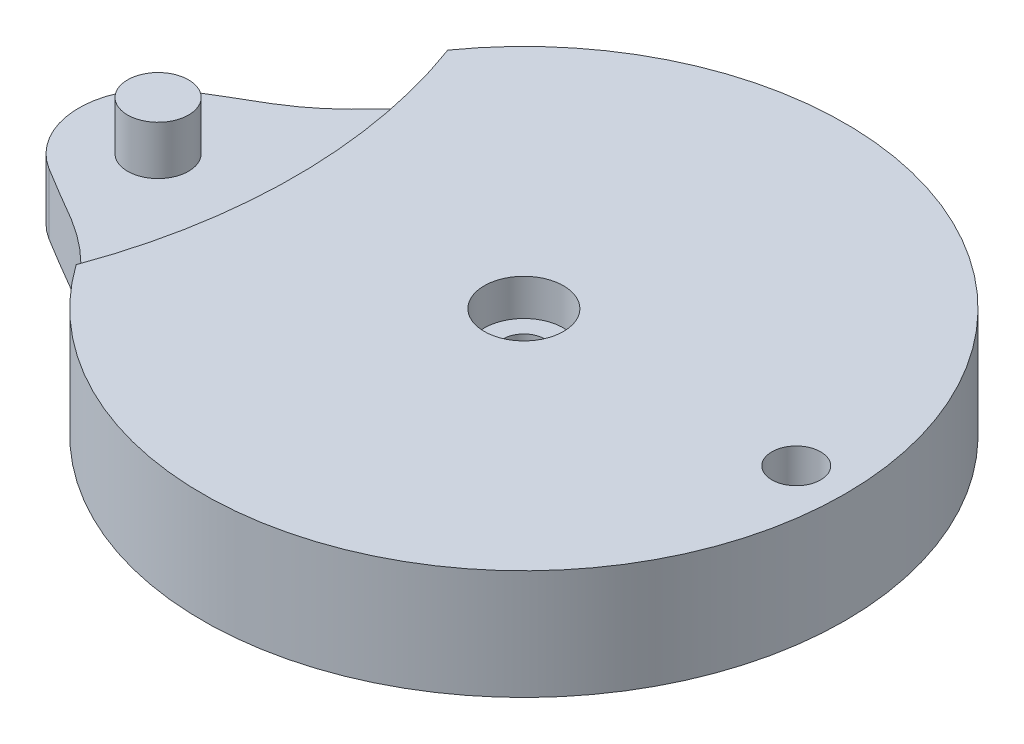
ISO-10303-21;
HEADER;
FILE_DESCRIPTION(('STEP AP214'),'2;1');
FILE_NAME('part.step','',(''),(''),'','','');
FILE_SCHEMA(('AUTOMOTIVE_DESIGN { 1 0 10303 214 1 1 1 1 }'));
ENDSEC;
DATA;
#1=APPLICATION_CONTEXT('core data for automotive mechanical design processes');
#2=APPLICATION_PROTOCOL_DEFINITION('international standard','automotive_design',2000,#1);
#3=PRODUCT_CONTEXT('',#1,'mechanical');
#4=PRODUCT('Part','Part','',(#3));
#5=PRODUCT_RELATED_PRODUCT_CATEGORY('part','',(#4));
#6=PRODUCT_DEFINITION_FORMATION('','',#4);
#7=PRODUCT_DEFINITION_CONTEXT('part definition',#1,'design');
#8=PRODUCT_DEFINITION('design','',#6,#7);
#9=PRODUCT_DEFINITION_SHAPE('','',#8);
#10=(LENGTH_UNIT() NAMED_UNIT(*) SI_UNIT(.MILLI.,.METRE.));
#11=(NAMED_UNIT(*) PLANE_ANGLE_UNIT() SI_UNIT($,.RADIAN.));
#12=(NAMED_UNIT(*) SI_UNIT($,.STERADIAN.) SOLID_ANGLE_UNIT());
#13=UNCERTAINTY_MEASURE_WITH_UNIT(LENGTH_MEASURE(1.E-05),#10,'distance_accuracy_value','');
#14=(GEOMETRIC_REPRESENTATION_CONTEXT(3) GLOBAL_UNCERTAINTY_ASSIGNED_CONTEXT((#13)) GLOBAL_UNIT_ASSIGNED_CONTEXT((#10,
#11,#12)) REPRESENTATION_CONTEXT('',''));
#15=CARTESIAN_POINT('',(0.,0.,0.));
#16=DIRECTION('',(0.,0.,1.));
#17=DIRECTION('',(1.,0.,0.));
#18=AXIS2_PLACEMENT_3D('',#15,#16,#17);
#19=CARTESIAN_POINT('',(0.,5.,0.));
#20=DIRECTION('',(0.,1.,0.));
#21=DIRECTION('',(0.,0.,1.));
#22=AXIS2_PLACEMENT_3D('',#19,#20,#21);
#23=PLANE('',#22);
#24=CARTESIAN_POINT('',(32.7560616139069,5.,0.));
#25=DIRECTION('',(0.,1.,0.));
#26=DIRECTION('',(0.,0.,1.));
#27=AXIS2_PLACEMENT_3D('',#24,#25,#26);
#28=CIRCLE('',#27,2.5);
#29=CARTESIAN_POINT('',(32.7560616139069,5.,2.5));
#30=VERTEX_POINT('',#29);
#31=EDGE_CURVE('E208',#30,#30,#28,.T.);
#32=ORIENTED_EDGE('',*,*,#31,.F.);
#33=EDGE_LOOP('',(#32));
#34=FACE_BOUND('',#33,.T.);
#35=CARTESIAN_POINT('',(29.2912891067249,5.,5.49957739044341));
#36=CARTESIAN_POINT('',(34.6216413062491,5.,8.85773683494919));
#37=CARTESIAN_POINT('',(35.589011304671,5.,8.41636074992716));
#38=CARTESIAN_POINT('',(41.2767844398048,5.,15.2389982055871));
#39=B_SPLINE_CURVE_WITH_KNOTS('',3,(#35,#36,#37,#38),.UNSPECIFIED.,.F.,.F.,(4,4),(0.,1.),.UNSPECIFIED.);
#40=CARTESIAN_POINT('',(29.2912891067249,5.,5.49957739044341));
#41=VERTEX_POINT('',#40);
#42=CARTESIAN_POINT('',(41.2767844398048,5.,15.2389982055871));
#43=VERTEX_POINT('',#42);
#44=EDGE_CURVE('E205',#41,#43,#39,.T.);
#45=ORIENTED_EDGE('',*,*,#44,.T.);
#46=CARTESIAN_POINT('',(0.,5.,0.));
#47=DIRECTION('',(0.,1.,0.));
#48=DIRECTION('',(0.,0.,1.));
#49=AXIS2_PLACEMENT_3D('',#46,#47,#48);
#50=CIRCLE('',#49,44.);
#51=CARTESIAN_POINT('',(41.2767844398048,5.,-15.2389982055871));
#52=VERTEX_POINT('',#51);
#53=EDGE_CURVE('E181',#43,#52,#50,.T.);
#54=ORIENTED_EDGE('',*,*,#53,.T.);
#55=CARTESIAN_POINT('',(29.2912891067249,5.,-5.49957739044341));
#56=CARTESIAN_POINT('',(34.6216413062491,5.,-8.85773683494919));
#57=CARTESIAN_POINT('',(35.589011304671,5.,-8.41636074992716));
#58=CARTESIAN_POINT('',(41.2767844398048,5.,-15.2389982055871));
#59=B_SPLINE_CURVE_WITH_KNOTS('',3,(#55,#56,#57,#58),.UNSPECIFIED.,.F.,.F.,(4,4),(0.,1.),.UNSPECIFIED.);
#60=CARTESIAN_POINT('',(29.2912891067249,5.,-5.49957739044341));
#61=VERTEX_POINT('',#60);
#62=EDGE_CURVE('E199',#61,#52,#59,.T.);
#63=ORIENTED_EDGE('',*,*,#62,.F.);
#64=CARTESIAN_POINT('',(32.7560616139069,5.,0.));
#65=DIRECTION('',(0.,1.,0.));
#66=DIRECTION('',(0.,0.,1.));
#67=AXIS2_PLACEMENT_3D('',#64,#65,#66);
#68=CIRCLE('',#67,6.5);
#69=EDGE_CURVE('E192',#61,#41,#68,.T.);
#70=ORIENTED_EDGE('',*,*,#69,.T.);
#71=EDGE_LOOP('',(#45,#54,#63,#70));
#72=FACE_BOUND('',#71,.T.);
#73=ADVANCED_FACE('F43',(#34,#72),#23,.T.);
#74=DIRECTION('',(0.,-1.,0.));
#75=VECTOR('',#74,1.);
#76=SURFACE_OF_LINEAR_EXTRUSION('',#59,#75);
#77=CARTESIAN_POINT('',(29.2912891067249,0.,-5.49957739044341));
#78=CARTESIAN_POINT('',(34.6216413062491,0.,-8.85773683494919));
#79=CARTESIAN_POINT('',(35.589011304671,0.,-8.41636074992716));
#80=CARTESIAN_POINT('',(41.2767844398048,0.,-15.2389982055871));
#81=B_SPLINE_CURVE_WITH_KNOTS('',3,(#77,#78,#79,#80),.UNSPECIFIED.,.F.,.F.,(4,4),(0.,1.),.UNSPECIFIED.);
#82=CARTESIAN_POINT('',(29.2912891067249,0.,-5.49957739044341));
#83=VERTEX_POINT('',#82);
#84=CARTESIAN_POINT('',(41.2767844398048,0.,-15.2389982055871));
#85=VERTEX_POINT('',#84);
#86=EDGE_CURVE('E187',#83,#85,#81,.T.);
#87=ORIENTED_EDGE('',*,*,#86,.F.);
#88=DIRECTION('',(0.,-1.,0.));
#89=VECTOR('',#88,1.);
#90=CARTESIAN_POINT('',(29.2912891067249,5.,-5.49957739044341));
#91=LINE('',#90,#89);
#92=EDGE_CURVE('E11',#61,#83,#91,.T.);
#93=ORIENTED_EDGE('',*,*,#92,.F.);
#94=ORIENTED_EDGE('',*,*,#62,.T.);
#95=DIRECTION('',(0.,-1.,0.));
#96=VECTOR('',#95,1.);
#97=CARTESIAN_POINT('',(41.2767844398048,5.,-15.2389982055871));
#98=LINE('',#97,#96);
#99=EDGE_CURVE('E91',#52,#85,#98,.T.);
#100=ORIENTED_EDGE('',*,*,#99,.T.);
#101=EDGE_LOOP('',(#87,#93,#94,#100));
#102=FACE_BOUND('',#101,.T.);
#103=ADVANCED_FACE('F45',(#102),#76,.T.);
#104=CARTESIAN_POINT('',(32.7560616139069,5.,0.));
#105=DIRECTION('',(0.,-1.,0.));
#106=DIRECTION('',(0.,0.,-1.));
#107=AXIS2_PLACEMENT_3D('',#104,#105,#106);
#108=CYLINDRICAL_SURFACE('',#107,6.5);
#109=CARTESIAN_POINT('',(32.7560616139069,0.,0.));
#110=DIRECTION('',(0.,1.,0.));
#111=DIRECTION('',(0.,0.,1.));
#112=AXIS2_PLACEMENT_3D('',#109,#110,#111);
#113=CIRCLE('',#112,6.5);
#114=CARTESIAN_POINT('',(29.2912891067249,0.,5.49957739044341));
#115=VERTEX_POINT('',#114);
#116=EDGE_CURVE('E262',#83,#115,#113,.T.);
#117=ORIENTED_EDGE('',*,*,#116,.T.);
#118=DIRECTION('',(0.,-1.,0.));
#119=VECTOR('',#118,1.);
#120=CARTESIAN_POINT('',(29.2912891067249,5.,5.49957739044341));
#121=LINE('',#120,#119);
#122=EDGE_CURVE('E53',#41,#115,#121,.T.);
#123=ORIENTED_EDGE('',*,*,#122,.F.);
#124=ORIENTED_EDGE('',*,*,#69,.F.);
#125=ORIENTED_EDGE('',*,*,#92,.T.);
#126=EDGE_LOOP('',(#117,#123,#124,#125));
#127=FACE_BOUND('',#126,.T.);
#128=ADVANCED_FACE('F224',(#127),#108,.T.);
#129=DIRECTION('',(0.,-1.,0.));
#130=VECTOR('',#129,1.);
#131=SURFACE_OF_LINEAR_EXTRUSION('',#39,#130);
#132=CARTESIAN_POINT('',(29.2912891067249,0.,5.49957739044341));
#133=CARTESIAN_POINT('',(34.6216413062491,0.,8.85773683494919));
#134=CARTESIAN_POINT('',(35.589011304671,0.,8.41636074992716));
#135=CARTESIAN_POINT('',(41.2767844398048,0.,15.2389982055871));
#136=B_SPLINE_CURVE_WITH_KNOTS('',3,(#132,#133,#134,#135),.UNSPECIFIED.,.F.,.F.,(4,4),(0.,1.),.UNSPECIFIED.);
#137=CARTESIAN_POINT('',(41.2767844398048,0.,15.2389982055871));
#138=VERTEX_POINT('',#137);
#139=EDGE_CURVE('E260',#115,#138,#136,.T.);
#140=ORIENTED_EDGE('',*,*,#139,.T.);
#141=DIRECTION('',(0.,-1.,0.));
#142=VECTOR('',#141,1.);
#143=CARTESIAN_POINT('',(41.2767844398048,5.,15.2389982055871));
#144=LINE('',#143,#142);
#145=EDGE_CURVE('E209',#43,#138,#144,.T.);
#146=ORIENTED_EDGE('',*,*,#145,.F.);
#147=ORIENTED_EDGE('',*,*,#44,.F.);
#148=ORIENTED_EDGE('',*,*,#122,.T.);
#149=EDGE_LOOP('',(#140,#146,#147,#148));
#150=FACE_BOUND('',#149,.T.);
#151=ADVANCED_FACE('F220',(#150),#131,.F.);
#152=CARTESIAN_POINT('',(62.7560616139069,5.,0.));
#153=DIRECTION('',(0.,-1.,0.));
#154=DIRECTION('',(0.,0.,-1.));
#155=AXIS2_PLACEMENT_3D('',#152,#153,#154);
#156=CYLINDRICAL_SURFACE('',#155,26.3360288242511);
#157=CARTESIAN_POINT('',(62.7560616139069,0.,0.));
#158=DIRECTION('',(0.,1.,0.));
#159=DIRECTION('',(0.,0.,1.));
#160=AXIS2_PLACEMENT_3D('',#157,#158,#159);
#161=CIRCLE('',#160,26.3360288242511);
#162=EDGE_CURVE('E202',#85,#138,#161,.F.);
#163=ORIENTED_EDGE('',*,*,#162,.F.);
#164=ORIENTED_EDGE('',*,*,#99,.F.);
#165=DIRECTION('',(0.,-1.,0.));
#166=VECTOR('',#165,1.);
#167=CARTESIAN_POINT('',(41.2767844398048,9.,-15.2389982055871));
#168=LINE('',#167,#166);
#169=CARTESIAN_POINT('',(41.2767844398048,9.,-15.2389982055871));
#170=VERTEX_POINT('',#169);
#171=EDGE_CURVE('E70',#170,#52,#168,.T.);
#172=ORIENTED_EDGE('',*,*,#171,.F.);
#173=CARTESIAN_POINT('',(62.7560616139069,9.,0.));
#174=DIRECTION('',(0.,-1.,0.));
#175=DIRECTION('',(0.,0.,-1.));
#176=AXIS2_PLACEMENT_3D('',#173,#174,#175);
#177=CIRCLE('',#176,26.3360288242511);
#178=CARTESIAN_POINT('',(41.2767844398048,9.,15.2389982055871));
#179=VERTEX_POINT('',#178);
#180=EDGE_CURVE('E179',#170,#179,#177,.T.);
#181=ORIENTED_EDGE('',*,*,#180,.T.);
#182=DIRECTION('',(0.,-1.,0.));
#183=VECTOR('',#182,1.);
#184=CARTESIAN_POINT('',(41.2767844398048,9.,15.2389982055871));
#185=LINE('',#184,#183);
#186=EDGE_CURVE('E174',#179,#43,#185,.T.);
#187=ORIENTED_EDGE('',*,*,#186,.T.);
#188=ORIENTED_EDGE('',*,*,#145,.T.);
#189=EDGE_LOOP('',(#163,#164,#172,#181,#187,#188));
#190=FACE_BOUND('',#189,.T.);
#191=ADVANCED_FACE('F223',(#190),#156,.T.);
#192=CARTESIAN_POINT('',(0.,0.,0.));
#193=DIRECTION('',(0.,1.,0.));
#194=DIRECTION('',(0.,0.,1.));
#195=AXIS2_PLACEMENT_3D('',#192,#193,#194);
#196=PLANE('',#195);
#197=DIRECTION('',(1.,0.,0.));
#198=VECTOR('',#197,1.);
#199=CARTESIAN_POINT('',(0.,0.,-1.));
#200=LINE('',#199,#198);
#201=CARTESIAN_POINT('',(67.3996055191585,0.,-1.));
#202=VERTEX_POINT('',#201);
#203=CARTESIAN_POINT('',(70.5060616139069,0.,-1.));
#204=VERTEX_POINT('',#203);
#205=EDGE_CURVE('E154',#202,#204,#200,.T.);
#206=ORIENTED_EDGE('',*,*,#205,.F.);
#207=CARTESIAN_POINT('',(62.7560616139069,0.,0.));
#208=DIRECTION('',(0.,-1.,0.));
#209=DIRECTION('',(0.,0.,-1.));
#210=AXIS2_PLACEMENT_3D('',#207,#208,#209);
#211=CIRCLE('',#210,4.75);
#212=CARTESIAN_POINT('',(67.3996055191585,0.,1.));
#213=VERTEX_POINT('',#212);
#214=EDGE_CURVE('E61',#213,#202,#211,.T.);
#215=ORIENTED_EDGE('',*,*,#214,.F.);
#216=DIRECTION('',(1.,0.,0.));
#217=VECTOR('',#216,1.);
#218=CARTESIAN_POINT('',(0.,0.,1.));
#219=LINE('',#218,#217);
#220=CARTESIAN_POINT('',(70.5060616139069,0.,1.));
#221=VERTEX_POINT('',#220);
#222=EDGE_CURVE('E142',#213,#221,#219,.T.);
#223=ORIENTED_EDGE('',*,*,#222,.T.);
#224=DIRECTION('',(0.,0.,-1.));
#225=VECTOR('',#224,1.);
#226=CARTESIAN_POINT('',(70.5060616139069,0.,0.));
#227=LINE('',#226,#225);
#228=EDGE_CURVE('E145',#221,#204,#227,.T.);
#229=ORIENTED_EDGE('',*,*,#228,.T.);
#230=EDGE_LOOP('',(#206,#215,#223,#229));
#231=FACE_BOUND('',#230,.T.);
#232=CARTESIAN_POINT('',(85.092090438158,0.,0.));
#233=DIRECTION('',(0.,1.,0.));
#234=DIRECTION('',(0.,0.,1.));
#235=AXIS2_PLACEMENT_3D('',#232,#233,#234);
#236=CIRCLE('',#235,2.);
#237=CARTESIAN_POINT('',(85.092090438158,0.,2.));
#238=VERTEX_POINT('',#237);
#239=EDGE_CURVE('E166',#238,#238,#236,.T.);
#240=ORIENTED_EDGE('',*,*,#239,.T.);
#241=EDGE_LOOP('',(#240));
#242=FACE_BOUND('',#241,.T.);
#243=ORIENTED_EDGE('',*,*,#162,.T.);
#244=ORIENTED_EDGE('',*,*,#139,.F.);
#245=ORIENTED_EDGE('',*,*,#116,.F.);
#246=ORIENTED_EDGE('',*,*,#86,.T.);
#247=EDGE_LOOP('',(#243,#244,#245,#246));
#248=FACE_BOUND('',#247,.T.);
#249=ADVANCED_FACE('F242',(#231,#242,#248),#196,.F.);
#250=CARTESIAN_POINT('',(32.7560616139069,9.,0.));
#251=DIRECTION('',(0.,-1.,0.));
#252=DIRECTION('',(0.,0.,-1.));
#253=AXIS2_PLACEMENT_3D('',#250,#251,#252);
#254=CYLINDRICAL_SURFACE('',#253,2.5);
#255=ORIENTED_EDGE('',*,*,#31,.T.);
#256=EDGE_LOOP('',(#255));
#257=FACE_BOUND('',#256,.T.);
#258=CARTESIAN_POINT('',(32.7560616139069,9.,0.));
#259=DIRECTION('',(0.,1.,0.));
#260=DIRECTION('',(0.,0.,1.));
#261=AXIS2_PLACEMENT_3D('',#258,#259,#260);
#262=CIRCLE('',#261,2.5);
#263=CARTESIAN_POINT('',(32.7560616139069,9.,2.5));
#264=VERTEX_POINT('',#263);
#265=EDGE_CURVE('E183',#264,#264,#262,.T.);
#266=ORIENTED_EDGE('',*,*,#265,.F.);
#267=EDGE_LOOP('',(#266));
#268=FACE_BOUND('',#267,.T.);
#269=ADVANCED_FACE('F240',(#257,#268),#254,.T.);
#270=CARTESIAN_POINT('',(0.,9.,0.));
#271=DIRECTION('',(0.,1.,0.));
#272=DIRECTION('',(0.,0.,1.));
#273=AXIS2_PLACEMENT_3D('',#270,#271,#272);
#274=PLANE('',#273);
#275=ORIENTED_EDGE('',*,*,#265,.T.);
#276=EDGE_LOOP('',(#275));
#277=FACE_BOUND('',#276,.T.);
#278=ADVANCED_FACE('F249',(#277),#274,.T.);
#279=CARTESIAN_POINT('',(0.,9.,0.));
#280=DIRECTION('',(0.,-1.,0.));
#281=DIRECTION('',(0.,0.,-1.));
#282=AXIS2_PLACEMENT_3D('',#279,#280,#281);
#283=CYLINDRICAL_SURFACE('',#282,44.);
#284=ORIENTED_EDGE('',*,*,#53,.F.);
#285=ORIENTED_EDGE('',*,*,#186,.F.);
#286=CARTESIAN_POINT('',(0.,9.,0.));
#287=DIRECTION('',(0.,-1.,0.));
#288=DIRECTION('',(0.,0.,-1.));
#289=AXIS2_PLACEMENT_3D('',#286,#287,#288);
#290=CIRCLE('',#289,44.);
#291=EDGE_CURVE('E178',#170,#179,#290,.T.);
#292=ORIENTED_EDGE('',*,*,#291,.F.);
#293=ORIENTED_EDGE('',*,*,#171,.T.);
#294=EDGE_LOOP('',(#284,#285,#292,#293));
#295=FACE_BOUND('',#294,.T.);
#296=ADVANCED_FACE('F274',(#295),#283,.F.);
#297=CARTESIAN_POINT('',(31.3780308069534,9.,0.));
#298=DIRECTION('',(0.,-1.,0.));
#299=DIRECTION('',(0.,0.,-1.));
#300=AXIS2_PLACEMENT_3D('',#297,#298,#299);
#301=PLANE('',#300);
#302=CARTESIAN_POINT('',(62.7560616139069,9.,0.));
#303=DIRECTION('',(0.,1.,0.));
#304=DIRECTION('',(0.,0.,1.));
#305=AXIS2_PLACEMENT_3D('',#302,#303,#304);
#306=CIRCLE('',#305,3.25);
#307=CARTESIAN_POINT('',(62.7560616139069,9.,3.25));
#308=VERTEX_POINT('',#307);
#309=EDGE_CURVE('E322',#308,#308,#306,.T.);
#310=ORIENTED_EDGE('',*,*,#309,.F.);
#311=EDGE_LOOP('',(#310));
#312=FACE_BOUND('',#311,.T.);
#313=CARTESIAN_POINT('',(85.092090438158,9.,0.));
#314=DIRECTION('',(0.,1.,0.));
#315=DIRECTION('',(0.,0.,1.));
#316=AXIS2_PLACEMENT_3D('',#313,#314,#315);
#317=CIRCLE('',#316,2.);
#318=CARTESIAN_POINT('',(85.092090438158,9.,2.));
#319=VERTEX_POINT('',#318);
#320=EDGE_CURVE('E160',#319,#319,#317,.T.);
#321=ORIENTED_EDGE('',*,*,#320,.F.);
#322=EDGE_LOOP('',(#321));
#323=FACE_BOUND('',#322,.T.);
#324=ORIENTED_EDGE('',*,*,#180,.F.);
#325=ORIENTED_EDGE('',*,*,#291,.T.);
#326=EDGE_LOOP('',(#324,#325));
#327=FACE_BOUND('',#326,.T.);
#328=ADVANCED_FACE('F278',(#312,#323,#327),#301,.F.);
#329=CARTESIAN_POINT('',(85.092090438158,-1.,0.));
#330=DIRECTION('',(0.,1.,0.));
#331=DIRECTION('',(0.,0.,1.));
#332=AXIS2_PLACEMENT_3D('',#329,#330,#331);
#333=CYLINDRICAL_SURFACE('',#332,2.);
#334=ORIENTED_EDGE('',*,*,#320,.T.);
#335=EDGE_LOOP('',(#334));
#336=FACE_BOUND('',#335,.T.);
#337=ORIENTED_EDGE('',*,*,#239,.F.);
#338=EDGE_LOOP('',(#337));
#339=FACE_BOUND('',#338,.T.);
#340=ADVANCED_FACE('F282',(#336,#339),#333,.F.);
#341=CARTESIAN_POINT('',(62.7560616139069,5.,0.));
#342=DIRECTION('',(0.,-1.,0.));
#343=DIRECTION('',(0.,0.,-1.));
#344=AXIS2_PLACEMENT_3D('',#341,#342,#343);
#345=CYLINDRICAL_SURFACE('',#344,4.75);
#346=ORIENTED_EDGE('',*,*,#214,.T.);
#347=DIRECTION('',(0.,-1.,0.));
#348=VECTOR('',#347,1.);
#349=CARTESIAN_POINT('',(67.3996055191585,5.,-1.));
#350=LINE('',#349,#348);
#351=CARTESIAN_POINT('',(67.3996055191585,5.,-1.));
#352=VERTEX_POINT('',#351);
#353=EDGE_CURVE('E121',#352,#202,#350,.T.);
#354=ORIENTED_EDGE('',*,*,#353,.F.);
#355=CARTESIAN_POINT('',(62.7560616139069,5.,0.));
#356=DIRECTION('',(0.,-1.,0.));
#357=DIRECTION('',(0.,0.,-1.));
#358=AXIS2_PLACEMENT_3D('',#355,#356,#357);
#359=CIRCLE('',#358,4.75);
#360=CARTESIAN_POINT('',(67.3996055191585,5.,1.));
#361=VERTEX_POINT('',#360);
#362=EDGE_CURVE('E125',#361,#352,#359,.T.);
#363=ORIENTED_EDGE('',*,*,#362,.F.);
#364=DIRECTION('',(0.,-1.,0.));
#365=VECTOR('',#364,1.);
#366=CARTESIAN_POINT('',(67.3996055191585,5.,1.));
#367=LINE('',#366,#365);
#368=EDGE_CURVE('E158',#361,#213,#367,.T.);
#369=ORIENTED_EDGE('',*,*,#368,.T.);
#370=EDGE_LOOP('',(#346,#354,#363,#369));
#371=FACE_BOUND('',#370,.T.);
#372=ADVANCED_FACE('F123',(#371),#345,.F.);
#373=CARTESIAN_POINT('',(0.,5.,1.));
#374=DIRECTION('',(0.,0.,-1.));
#375=DIRECTION('',(-1.,0.,0.));
#376=AXIS2_PLACEMENT_3D('',#373,#374,#375);
#377=PLANE('',#376);
#378=ORIENTED_EDGE('',*,*,#222,.F.);
#379=ORIENTED_EDGE('',*,*,#368,.F.);
#380=DIRECTION('',(1.,0.,0.));
#381=VECTOR('',#380,1.);
#382=CARTESIAN_POINT('',(0.,5.,1.));
#383=LINE('',#382,#381);
#384=CARTESIAN_POINT('',(70.5060616139069,5.,1.));
#385=VERTEX_POINT('',#384);
#386=EDGE_CURVE('E130',#361,#385,#383,.T.);
#387=ORIENTED_EDGE('',*,*,#386,.T.);
#388=DIRECTION('',(0.,-1.,0.));
#389=VECTOR('',#388,1.);
#390=CARTESIAN_POINT('',(70.5060616139069,5.,1.));
#391=LINE('',#390,#389);
#392=EDGE_CURVE('E161',#385,#221,#391,.T.);
#393=ORIENTED_EDGE('',*,*,#392,.T.);
#394=EDGE_LOOP('',(#378,#379,#387,#393));
#395=FACE_BOUND('',#394,.T.);
#396=ADVANCED_FACE('F290',(#395),#377,.T.);
#397=CARTESIAN_POINT('',(70.5060616139069,5.,0.));
#398=DIRECTION('',(-1.,0.,0.));
#399=DIRECTION('',(0.,0.,1.));
#400=AXIS2_PLACEMENT_3D('',#397,#398,#399);
#401=PLANE('',#400);
#402=ORIENTED_EDGE('',*,*,#228,.F.);
#403=ORIENTED_EDGE('',*,*,#392,.F.);
#404=DIRECTION('',(0.,0.,-1.));
#405=VECTOR('',#404,1.);
#406=CARTESIAN_POINT('',(70.5060616139069,5.,0.));
#407=LINE('',#406,#405);
#408=CARTESIAN_POINT('',(70.5060616139069,5.,-1.));
#409=VERTEX_POINT('',#408);
#410=EDGE_CURVE('E138',#385,#409,#407,.T.);
#411=ORIENTED_EDGE('',*,*,#410,.T.);
#412=DIRECTION('',(0.,-1.,0.));
#413=VECTOR('',#412,1.);
#414=CARTESIAN_POINT('',(70.5060616139069,5.,-1.));
#415=LINE('',#414,#413);
#416=EDGE_CURVE('E129',#409,#204,#415,.T.);
#417=ORIENTED_EDGE('',*,*,#416,.T.);
#418=EDGE_LOOP('',(#402,#403,#411,#417));
#419=FACE_BOUND('',#418,.T.);
#420=ADVANCED_FACE('F293',(#419),#401,.T.);
#421=CARTESIAN_POINT('',(0.,5.,-1.));
#422=DIRECTION('',(0.,0.,-1.));
#423=DIRECTION('',(-1.,0.,0.));
#424=AXIS2_PLACEMENT_3D('',#421,#422,#423);
#425=PLANE('',#424);
#426=ORIENTED_EDGE('',*,*,#205,.T.);
#427=ORIENTED_EDGE('',*,*,#416,.F.);
#428=DIRECTION('',(1.,0.,0.));
#429=VECTOR('',#428,1.);
#430=CARTESIAN_POINT('',(0.,5.,-1.));
#431=LINE('',#430,#429);
#432=EDGE_CURVE('E134',#352,#409,#431,.T.);
#433=ORIENTED_EDGE('',*,*,#432,.F.);
#434=ORIENTED_EDGE('',*,*,#353,.T.);
#435=EDGE_LOOP('',(#426,#427,#433,#434));
#436=FACE_BOUND('',#435,.T.);
#437=ADVANCED_FACE('F135',(#436),#425,.F.);
#438=CARTESIAN_POINT('',(0.,5.,0.));
#439=DIRECTION('',(0.,-1.,0.));
#440=DIRECTION('',(0.,0.,-1.));
#441=AXIS2_PLACEMENT_3D('',#438,#439,#440);
#442=PLANE('',#441);
#443=CARTESIAN_POINT('',(62.7560616139069,5.,0.));
#444=DIRECTION('',(0.,-1.,0.));
#445=DIRECTION('',(0.,0.,-1.));
#446=AXIS2_PLACEMENT_3D('',#443,#444,#445);
#447=CIRCLE('',#446,1.69999999999999);
#448=CARTESIAN_POINT('',(62.7560616139069,5.,-1.69999999999999));
#449=VERTEX_POINT('',#448);
#450=EDGE_CURVE('E48',#449,#449,#447,.T.);
#451=ORIENTED_EDGE('',*,*,#450,.F.);
#452=EDGE_LOOP('',(#451));
#453=FACE_BOUND('',#452,.T.);
#454=ORIENTED_EDGE('',*,*,#362,.T.);
#455=ORIENTED_EDGE('',*,*,#432,.T.);
#456=ORIENTED_EDGE('',*,*,#410,.F.);
#457=ORIENTED_EDGE('',*,*,#386,.F.);
#458=EDGE_LOOP('',(#454,#455,#456,#457));
#459=FACE_BOUND('',#458,.T.);
#460=ADVANCED_FACE('F141',(#453,#459),#442,.T.);
#461=CARTESIAN_POINT('',(62.7560616139069,9.,0.));
#462=DIRECTION('',(0.,1.,0.));
#463=DIRECTION('',(0.,0.,1.));
#464=AXIS2_PLACEMENT_3D('',#461,#462,#463);
#465=CYLINDRICAL_SURFACE('',#464,1.69999999999999);
#466=ORIENTED_EDGE('',*,*,#450,.T.);
#467=EDGE_LOOP('',(#466));
#468=FACE_BOUND('',#467,.T.);
#469=CARTESIAN_POINT('',(62.7560616139069,6.,0.));
#470=DIRECTION('',(0.,1.,0.));
#471=DIRECTION('',(0.,0.,1.));
#472=AXIS2_PLACEMENT_3D('',#469,#470,#471);
#473=CIRCLE('',#472,1.69999999999999);
#474=CARTESIAN_POINT('',(62.7560616139069,6.,1.69999999999999));
#475=VERTEX_POINT('',#474);
#476=EDGE_CURVE('E148',#475,#475,#473,.T.);
#477=ORIENTED_EDGE('',*,*,#476,.T.);
#478=EDGE_LOOP('',(#477));
#479=FACE_BOUND('',#478,.T.);
#480=ADVANCED_FACE('F302',(#468,#479),#465,.F.);
#481=CARTESIAN_POINT('',(64.4560616139069,6.,0.));
#482=DIRECTION('',(0.,-1.,0.));
#483=DIRECTION('',(0.,0.,-1.));
#484=AXIS2_PLACEMENT_3D('',#481,#482,#483);
#485=PLANE('',#484);
#486=ORIENTED_EDGE('',*,*,#476,.F.);
#487=EDGE_LOOP('',(#486));
#488=FACE_BOUND('',#487,.T.);
#489=CARTESIAN_POINT('',(62.7560616139069,6.,0.));
#490=DIRECTION('',(0.,1.,0.));
#491=DIRECTION('',(0.,0.,1.));
#492=AXIS2_PLACEMENT_3D('',#489,#490,#491);
#493=CIRCLE('',#492,3.25);
#494=CARTESIAN_POINT('',(62.7560616139069,6.,3.25));
#495=VERTEX_POINT('',#494);
#496=EDGE_CURVE('E319',#495,#495,#493,.T.);
#497=ORIENTED_EDGE('',*,*,#496,.T.);
#498=EDGE_LOOP('',(#497));
#499=FACE_BOUND('',#498,.T.);
#500=ADVANCED_FACE('F306',(#488,#499),#485,.F.);
#501=CARTESIAN_POINT('',(62.7560616139069,9.,0.));
#502=DIRECTION('',(0.,1.,0.));
#503=DIRECTION('',(0.,0.,1.));
#504=AXIS2_PLACEMENT_3D('',#501,#502,#503);
#505=CYLINDRICAL_SURFACE('',#504,3.25);
#506=ORIENTED_EDGE('',*,*,#496,.F.);
#507=EDGE_LOOP('',(#506));
#508=FACE_BOUND('',#507,.T.);
#509=ORIENTED_EDGE('',*,*,#309,.T.);
#510=EDGE_LOOP('',(#509));
#511=FACE_BOUND('',#510,.T.);
#512=ADVANCED_FACE('F310',(#508,#511),#505,.F.);
#513=CLOSED_SHELL('',(#73,#103,#128,#151,#191,#249,#269,#278,#296,#328,#340,#372,#396,#420,#437,
#460,#480,#500,#512));
#514=MANIFOLD_SOLID_BREP('B2',#513);
#515=ADVANCED_BREP_SHAPE_REPRESENTATION('',(#18,#514),#14);
#516=SHAPE_DEFINITION_REPRESENTATION(#9,#515);
ENDSEC;
END-ISO-10303-21;
